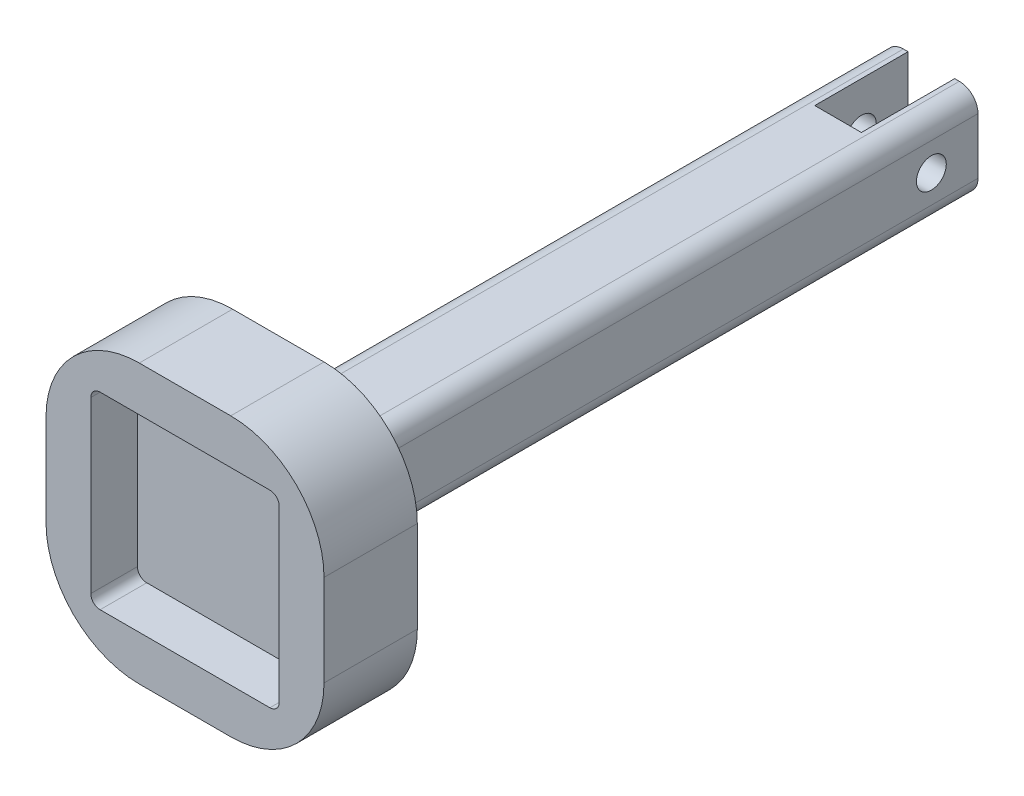
ISO-10303-21;
HEADER;
FILE_DESCRIPTION(('STEP AP214'),'2;1');
FILE_NAME('part.step','',(''),(''),'','','');
FILE_SCHEMA(('AUTOMOTIVE_DESIGN { 1 0 10303 214 1 1 1 1 }'));
ENDSEC;
DATA;
#1=APPLICATION_CONTEXT('core data for automotive mechanical design processes');
#2=APPLICATION_PROTOCOL_DEFINITION('international standard','automotive_design',2000,#1);
#3=PRODUCT_CONTEXT('',#1,'mechanical');
#4=PRODUCT('Part','Part','',(#3));
#5=PRODUCT_RELATED_PRODUCT_CATEGORY('part','',(#4));
#6=PRODUCT_DEFINITION_FORMATION('','',#4);
#7=PRODUCT_DEFINITION_CONTEXT('part definition',#1,'design');
#8=PRODUCT_DEFINITION('design','',#6,#7);
#9=PRODUCT_DEFINITION_SHAPE('','',#8);
#10=(LENGTH_UNIT() NAMED_UNIT(*) SI_UNIT(.MILLI.,.METRE.));
#11=(NAMED_UNIT(*) PLANE_ANGLE_UNIT() SI_UNIT($,.RADIAN.));
#12=(NAMED_UNIT(*) SI_UNIT($,.STERADIAN.) SOLID_ANGLE_UNIT());
#13=UNCERTAINTY_MEASURE_WITH_UNIT(LENGTH_MEASURE(1.E-05),#10,'distance_accuracy_value','');
#14=(GEOMETRIC_REPRESENTATION_CONTEXT(3) GLOBAL_UNCERTAINTY_ASSIGNED_CONTEXT((#13)) GLOBAL_UNIT_ASSIGNED_CONTEXT((#10,
#11,#12)) REPRESENTATION_CONTEXT('',''));
#15=CARTESIAN_POINT('',(0.,0.,0.));
#16=DIRECTION('',(0.,0.,1.));
#17=DIRECTION('',(1.,0.,0.));
#18=AXIS2_PLACEMENT_3D('',#15,#16,#17);
#19=CARTESIAN_POINT('',(0.,0.,-70.));
#20=DIRECTION('',(0.,0.,1.));
#21=DIRECTION('',(1.,0.,0.));
#22=AXIS2_PLACEMENT_3D('',#19,#20,#21);
#23=PLANE('',#22);
#24=DIRECTION('',(0.,-1.,0.));
#25=VECTOR('',#24,1.);
#26=CARTESIAN_POINT('',(5.,-5.,-70.));
#27=LINE('',#26,#25);
#28=CARTESIAN_POINT('',(5.,3.,-70.));
#29=VERTEX_POINT('',#28);
#30=CARTESIAN_POINT('',(5.,-3.,-70.));
#31=VERTEX_POINT('',#30);
#32=EDGE_CURVE('E327',#29,#31,#27,.T.);
#33=ORIENTED_EDGE('',*,*,#32,.T.);
#34=CARTESIAN_POINT('',(3.,-3.,-70.));
#35=DIRECTION('',(0.,0.,1.));
#36=DIRECTION('',(1.,0.,0.));
#37=AXIS2_PLACEMENT_3D('',#34,#35,#36);
#38=CIRCLE('',#37,2.);
#39=CARTESIAN_POINT('',(3.,-5.,-70.));
#40=VERTEX_POINT('',#39);
#41=EDGE_CURVE('E434',#31,#40,#38,.F.);
#42=ORIENTED_EDGE('',*,*,#41,.T.);
#43=DIRECTION('',(-1.,0.,0.));
#44=VECTOR('',#43,1.);
#45=CARTESIAN_POINT('',(5.,-5.,-70.));
#46=LINE('',#45,#44);
#47=CARTESIAN_POINT('',(2.49999999999999,-5.,-70.));
#48=VERTEX_POINT('',#47);
#49=EDGE_CURVE('E331',#40,#48,#46,.T.);
#50=ORIENTED_EDGE('',*,*,#49,.T.);
#51=DIRECTION('',(0.,1.,0.));
#52=VECTOR('',#51,1.);
#53=CARTESIAN_POINT('',(2.49999999999999,0.,-70.));
#54=LINE('',#53,#52);
#55=CARTESIAN_POINT('',(2.49999999999999,5.,-70.));
#56=VERTEX_POINT('',#55);
#57=EDGE_CURVE('E405',#48,#56,#54,.T.);
#58=ORIENTED_EDGE('',*,*,#57,.T.);
#59=DIRECTION('',(1.,0.,0.));
#60=VECTOR('',#59,1.);
#61=CARTESIAN_POINT('',(5.,5.,-70.));
#62=LINE('',#61,#60);
#63=CARTESIAN_POINT('',(3.,5.,-70.));
#64=VERTEX_POINT('',#63);
#65=EDGE_CURVE('E323',#56,#64,#62,.T.);
#66=ORIENTED_EDGE('',*,*,#65,.T.);
#67=CARTESIAN_POINT('',(3.,3.,-70.));
#68=DIRECTION('',(0.,0.,1.));
#69=DIRECTION('',(1.,0.,0.));
#70=AXIS2_PLACEMENT_3D('',#67,#68,#69);
#71=CIRCLE('',#70,2.);
#72=EDGE_CURVE('E432',#64,#29,#71,.F.);
#73=ORIENTED_EDGE('',*,*,#72,.T.);
#74=EDGE_LOOP('',(#33,#42,#50,#58,#66,#73));
#75=FACE_BOUND('',#74,.T.);
#76=ADVANCED_FACE('F33',(#75),#23,.F.);
#77=CARTESIAN_POINT('',(-14.9,-14.9,10.));
#78=DIRECTION('',(-1.,0.,0.));
#79=DIRECTION('',(0.,0.,1.));
#80=AXIS2_PLACEMENT_3D('',#77,#78,#79);
#81=PLANE('',#80);
#82=DIRECTION('',(0.,1.,0.));
#83=VECTOR('',#82,1.);
#84=CARTESIAN_POINT('',(-14.9,-14.9,0.));
#85=LINE('',#84,#83);
#86=CARTESIAN_POINT('',(-14.9,-4.9,0.));
#87=VERTEX_POINT('',#86);
#88=CARTESIAN_POINT('',(-14.9,4.9,0.));
#89=VERTEX_POINT('',#88);
#90=EDGE_CURVE('E333',#87,#89,#85,.T.);
#91=ORIENTED_EDGE('',*,*,#90,.F.);
#92=DIRECTION('',(0.,0.,-1.));
#93=VECTOR('',#92,1.);
#94=CARTESIAN_POINT('',(-14.9,-4.9,10.));
#95=LINE('',#94,#93);
#96=CARTESIAN_POINT('',(-14.9,-4.9,10.));
#97=VERTEX_POINT('',#96);
#98=EDGE_CURVE('E395',#87,#97,#95,.F.);
#99=ORIENTED_EDGE('',*,*,#98,.T.);
#100=DIRECTION('',(0.,1.,0.));
#101=VECTOR('',#100,1.);
#102=CARTESIAN_POINT('',(-14.9,-14.9,10.));
#103=LINE('',#102,#101);
#104=CARTESIAN_POINT('',(-14.9,4.9,10.));
#105=VERTEX_POINT('',#104);
#106=EDGE_CURVE('E343',#97,#105,#103,.T.);
#107=ORIENTED_EDGE('',*,*,#106,.T.);
#108=DIRECTION('',(0.,0.,-1.));
#109=VECTOR('',#108,1.);
#110=CARTESIAN_POINT('',(-14.9,4.9,10.));
#111=LINE('',#110,#109);
#112=EDGE_CURVE('E392',#105,#89,#111,.T.);
#113=ORIENTED_EDGE('',*,*,#112,.T.);
#114=EDGE_LOOP('',(#91,#99,#107,#113));
#115=FACE_BOUND('',#114,.T.);
#116=ADVANCED_FACE('F500',(#115),#81,.T.);
#117=CARTESIAN_POINT('',(-14.9,-14.9,10.));
#118=DIRECTION('',(0.,1.,0.));
#119=DIRECTION('',(0.,0.,1.));
#120=AXIS2_PLACEMENT_3D('',#117,#118,#119);
#121=PLANE('',#120);
#122=DIRECTION('',(1.,0.,0.));
#123=VECTOR('',#122,1.);
#124=CARTESIAN_POINT('',(-14.9,-14.9,0.));
#125=LINE('',#124,#123);
#126=CARTESIAN_POINT('',(-4.9,-14.9,0.));
#127=VERTEX_POINT('',#126);
#128=CARTESIAN_POINT('',(4.9,-14.9,0.));
#129=VERTEX_POINT('',#128);
#130=EDGE_CURVE('E347',#127,#129,#125,.T.);
#131=ORIENTED_EDGE('',*,*,#130,.T.);
#132=DIRECTION('',(0.,0.,-1.));
#133=VECTOR('',#132,1.);
#134=CARTESIAN_POINT('',(4.9,-14.9,10.));
#135=LINE('',#134,#133);
#136=CARTESIAN_POINT('',(4.9,-14.9,10.));
#137=VERTEX_POINT('',#136);
#138=EDGE_CURVE('E382',#129,#137,#135,.F.);
#139=ORIENTED_EDGE('',*,*,#138,.T.);
#140=DIRECTION('',(1.,0.,0.));
#141=VECTOR('',#140,1.);
#142=CARTESIAN_POINT('',(-14.9,-14.9,10.));
#143=LINE('',#142,#141);
#144=CARTESIAN_POINT('',(-4.9,-14.9,10.));
#145=VERTEX_POINT('',#144);
#146=EDGE_CURVE('E353',#145,#137,#143,.T.);
#147=ORIENTED_EDGE('',*,*,#146,.F.);
#148=DIRECTION('',(0.,0.,-1.));
#149=VECTOR('',#148,1.);
#150=CARTESIAN_POINT('',(-4.9,-14.9,0.));
#151=LINE('',#150,#149);
#152=EDGE_CURVE('E379',#145,#127,#151,.T.);
#153=ORIENTED_EDGE('',*,*,#152,.T.);
#154=EDGE_LOOP('',(#131,#139,#147,#153));
#155=FACE_BOUND('',#154,.T.);
#156=ADVANCED_FACE('F505',(#155),#121,.F.);
#157=CARTESIAN_POINT('',(14.9,-14.9,10.));
#158=DIRECTION('',(-1.,0.,0.));
#159=DIRECTION('',(0.,0.,1.));
#160=AXIS2_PLACEMENT_3D('',#157,#158,#159);
#161=PLANE('',#160);
#162=DIRECTION('',(0.,1.,0.));
#163=VECTOR('',#162,1.);
#164=CARTESIAN_POINT('',(14.9,-14.9,10.));
#165=LINE('',#164,#163);
#166=CARTESIAN_POINT('',(14.9,-4.9,10.));
#167=VERTEX_POINT('',#166);
#168=CARTESIAN_POINT('',(14.9,4.9,10.));
#169=VERTEX_POINT('',#168);
#170=EDGE_CURVE('E350',#167,#169,#165,.T.);
#171=ORIENTED_EDGE('',*,*,#170,.F.);
#172=DIRECTION('',(0.,0.,-1.));
#173=VECTOR('',#172,1.);
#174=CARTESIAN_POINT('',(14.9,-4.9,10.));
#175=LINE('',#174,#173);
#176=CARTESIAN_POINT('',(14.9,-4.9,0.));
#177=VERTEX_POINT('',#176);
#178=EDGE_CURVE('E368',#167,#177,#175,.T.);
#179=ORIENTED_EDGE('',*,*,#178,.T.);
#180=DIRECTION('',(0.,1.,0.));
#181=VECTOR('',#180,1.);
#182=CARTESIAN_POINT('',(14.9,-14.9,0.));
#183=LINE('',#182,#181);
#184=CARTESIAN_POINT('',(14.9,4.9,0.));
#185=VERTEX_POINT('',#184);
#186=EDGE_CURVE('E362',#177,#185,#183,.T.);
#187=ORIENTED_EDGE('',*,*,#186,.T.);
#188=DIRECTION('',(0.,0.,-1.));
#189=VECTOR('',#188,1.);
#190=CARTESIAN_POINT('',(14.9,4.9,10.));
#191=LINE('',#190,#189);
#192=EDGE_CURVE('E356',#185,#169,#191,.F.);
#193=ORIENTED_EDGE('',*,*,#192,.T.);
#194=EDGE_LOOP('',(#171,#179,#187,#193));
#195=FACE_BOUND('',#194,.T.);
#196=ADVANCED_FACE('F538',(#195),#161,.F.);
#197=CARTESIAN_POINT('',(-14.9,14.9,10.));
#198=DIRECTION('',(0.,1.,0.));
#199=DIRECTION('',(0.,0.,1.));
#200=AXIS2_PLACEMENT_3D('',#197,#198,#199);
#201=PLANE('',#200);
#202=DIRECTION('',(1.,0.,0.));
#203=VECTOR('',#202,1.);
#204=CARTESIAN_POINT('',(-14.9,14.9,10.));
#205=LINE('',#204,#203);
#206=CARTESIAN_POINT('',(-4.9,14.9,10.));
#207=VERTEX_POINT('',#206);
#208=CARTESIAN_POINT('',(4.9,14.9,10.));
#209=VERTEX_POINT('',#208);
#210=EDGE_CURVE('E346',#207,#209,#205,.T.);
#211=ORIENTED_EDGE('',*,*,#210,.T.);
#212=DIRECTION('',(0.,0.,-1.));
#213=VECTOR('',#212,1.);
#214=CARTESIAN_POINT('',(4.9,14.9,0.));
#215=LINE('',#214,#213);
#216=CARTESIAN_POINT('',(4.9,14.9,0.));
#217=VERTEX_POINT('',#216);
#218=EDGE_CURVE('E399',#209,#217,#215,.T.);
#219=ORIENTED_EDGE('',*,*,#218,.T.);
#220=DIRECTION('',(1.,0.,0.));
#221=VECTOR('',#220,1.);
#222=CARTESIAN_POINT('',(-14.9,14.9,0.));
#223=LINE('',#222,#221);
#224=CARTESIAN_POINT('',(-4.9,14.9,0.));
#225=VERTEX_POINT('',#224);
#226=EDGE_CURVE('E359',#225,#217,#223,.T.);
#227=ORIENTED_EDGE('',*,*,#226,.F.);
#228=DIRECTION('',(0.,0.,-1.));
#229=VECTOR('',#228,1.);
#230=CARTESIAN_POINT('',(-4.9,14.9,10.));
#231=LINE('',#230,#229);
#232=EDGE_CURVE('E397',#225,#207,#231,.F.);
#233=ORIENTED_EDGE('',*,*,#232,.T.);
#234=EDGE_LOOP('',(#211,#219,#227,#233));
#235=FACE_BOUND('',#234,.T.);
#236=ADVANCED_FACE('F531',(#235),#201,.T.);
#237=CARTESIAN_POINT('',(0.,0.,10.));
#238=DIRECTION('',(0.,0.,-1.));
#239=DIRECTION('',(-1.,0.,0.));
#240=AXIS2_PLACEMENT_3D('',#237,#238,#239);
#241=PLANE('',#240);
#242=DIRECTION('',(1.,0.,0.));
#243=VECTOR('',#242,1.);
#244=CARTESIAN_POINT('',(-9.09999999999999,-10.1,10.));
#245=LINE('',#244,#243);
#246=CARTESIAN_POINT('',(-9.09999999999999,-10.1,10.));
#247=VERTEX_POINT('',#246);
#248=CARTESIAN_POINT('',(9.09999999999999,-10.1,10.));
#249=VERTEX_POINT('',#248);
#250=EDGE_CURVE('E262',#247,#249,#245,.T.);
#251=ORIENTED_EDGE('',*,*,#250,.F.);
#252=CARTESIAN_POINT('',(-9.1,-9.1,10.));
#253=DIRECTION('',(0.,0.,1.));
#254=DIRECTION('',(-1.,0.,0.));
#255=AXIS2_PLACEMENT_3D('',#252,#253,#254);
#256=CIRCLE('',#255,0.999999999999999);
#257=CARTESIAN_POINT('',(-10.1,-9.09999999999999,10.));
#258=VERTEX_POINT('',#257);
#259=EDGE_CURVE('E224',#258,#247,#256,.T.);
#260=ORIENTED_EDGE('',*,*,#259,.F.);
#261=DIRECTION('',(0.,-1.,0.));
#262=VECTOR('',#261,1.);
#263=CARTESIAN_POINT('',(-10.1,-9.09999999999999,10.));
#264=LINE('',#263,#262);
#265=CARTESIAN_POINT('',(-10.1,9.09999999999999,10.));
#266=VERTEX_POINT('',#265);
#267=EDGE_CURVE('E242',#266,#258,#264,.T.);
#268=ORIENTED_EDGE('',*,*,#267,.F.);
#269=CARTESIAN_POINT('',(-9.1,9.1,10.));
#270=DIRECTION('',(0.,0.,1.));
#271=DIRECTION('',(-1.,0.,0.));
#272=AXIS2_PLACEMENT_3D('',#269,#270,#271);
#273=CIRCLE('',#272,0.999999999999999);
#274=CARTESIAN_POINT('',(-9.09999999999999,10.1,10.));
#275=VERTEX_POINT('',#274);
#276=EDGE_CURVE('E245',#275,#266,#273,.T.);
#277=ORIENTED_EDGE('',*,*,#276,.F.);
#278=DIRECTION('',(-1.,0.,0.));
#279=VECTOR('',#278,1.);
#280=CARTESIAN_POINT('',(-9.09999999999999,10.1,10.));
#281=LINE('',#280,#279);
#282=CARTESIAN_POINT('',(9.09999999999999,10.1,10.));
#283=VERTEX_POINT('',#282);
#284=EDGE_CURVE('E273',#283,#275,#281,.T.);
#285=ORIENTED_EDGE('',*,*,#284,.F.);
#286=CARTESIAN_POINT('',(9.1,9.1,10.));
#287=DIRECTION('',(0.,0.,1.));
#288=DIRECTION('',(-1.,0.,0.));
#289=AXIS2_PLACEMENT_3D('',#286,#287,#288);
#290=CIRCLE('',#289,0.999999999999999);
#291=CARTESIAN_POINT('',(10.1,9.09999999999999,10.));
#292=VERTEX_POINT('',#291);
#293=EDGE_CURVE('E270',#292,#283,#290,.T.);
#294=ORIENTED_EDGE('',*,*,#293,.F.);
#295=DIRECTION('',(0.,1.,0.));
#296=VECTOR('',#295,1.);
#297=CARTESIAN_POINT('',(10.1,-9.09999999999999,10.));
#298=LINE('',#297,#296);
#299=CARTESIAN_POINT('',(10.1,-9.1,10.));
#300=VERTEX_POINT('',#299);
#301=EDGE_CURVE('E267',#300,#292,#298,.T.);
#302=ORIENTED_EDGE('',*,*,#301,.F.);
#303=CARTESIAN_POINT('',(9.1,-9.1,10.));
#304=DIRECTION('',(0.,0.,1.));
#305=DIRECTION('',(1.,0.,0.));
#306=AXIS2_PLACEMENT_3D('',#303,#304,#305);
#307=CIRCLE('',#306,0.999999999999999);
#308=EDGE_CURVE('E264',#249,#300,#307,.T.);
#309=ORIENTED_EDGE('',*,*,#308,.F.);
#310=EDGE_LOOP('',(#251,#260,#268,#277,#285,#294,#302,#309));
#311=FACE_BOUND('',#310,.T.);
#312=ORIENTED_EDGE('',*,*,#146,.T.);
#313=CARTESIAN_POINT('',(4.9,-4.9,10.));
#314=DIRECTION('',(0.,0.,-1.));
#315=DIRECTION('',(-1.,0.,0.));
#316=AXIS2_PLACEMENT_3D('',#313,#314,#315);
#317=CIRCLE('',#316,10.);
#318=EDGE_CURVE('E390',#137,#167,#317,.F.);
#319=ORIENTED_EDGE('',*,*,#318,.T.);
#320=ORIENTED_EDGE('',*,*,#170,.T.);
#321=CARTESIAN_POINT('',(4.9,4.9,10.));
#322=DIRECTION('',(0.,0.,-1.));
#323=DIRECTION('',(-1.,0.,0.));
#324=AXIS2_PLACEMENT_3D('',#321,#322,#323);
#325=CIRCLE('',#324,10.);
#326=EDGE_CURVE('E386',#169,#209,#325,.F.);
#327=ORIENTED_EDGE('',*,*,#326,.T.);
#328=ORIENTED_EDGE('',*,*,#210,.F.);
#329=CARTESIAN_POINT('',(-4.9,4.9,10.));
#330=DIRECTION('',(0.,0.,-1.));
#331=DIRECTION('',(-1.,0.,0.));
#332=AXIS2_PLACEMENT_3D('',#329,#330,#331);
#333=CIRCLE('',#332,10.);
#334=EDGE_CURVE('E384',#207,#105,#333,.F.);
#335=ORIENTED_EDGE('',*,*,#334,.T.);
#336=ORIENTED_EDGE('',*,*,#106,.F.);
#337=CARTESIAN_POINT('',(-4.9,-4.9,10.));
#338=DIRECTION('',(0.,0.,-1.));
#339=DIRECTION('',(-1.,0.,0.));
#340=AXIS2_PLACEMENT_3D('',#337,#338,#339);
#341=CIRCLE('',#340,10.);
#342=EDGE_CURVE('E388',#97,#145,#341,.F.);
#343=ORIENTED_EDGE('',*,*,#342,.T.);
#344=EDGE_LOOP('',(#312,#319,#320,#327,#328,#335,#336,#343));
#345=FACE_BOUND('',#344,.T.);
#346=ADVANCED_FACE('F528',(#311,#345),#241,.F.);
#347=CARTESIAN_POINT('',(0.,0.,0.));
#348=DIRECTION('',(0.,0.,-1.));
#349=DIRECTION('',(-1.,0.,0.));
#350=AXIS2_PLACEMENT_3D('',#347,#348,#349);
#351=PLANE('',#350);
#352=DIRECTION('',(0.,1.,0.));
#353=VECTOR('',#352,1.);
#354=CARTESIAN_POINT('',(-5.,-5.,0.));
#355=LINE('',#354,#353);
#356=CARTESIAN_POINT('',(-5.,-3.,0.));
#357=VERTEX_POINT('',#356);
#358=CARTESIAN_POINT('',(-5.,3.,0.));
#359=VERTEX_POINT('',#358);
#360=EDGE_CURVE('E319',#357,#359,#355,.T.);
#361=ORIENTED_EDGE('',*,*,#360,.F.);
#362=CARTESIAN_POINT('',(-3.,-3.,0.));
#363=DIRECTION('',(0.,0.,-1.));
#364=DIRECTION('',(-1.,0.,0.));
#365=AXIS2_PLACEMENT_3D('',#362,#363,#364);
#366=CIRCLE('',#365,2.);
#367=CARTESIAN_POINT('',(-3.,-5.,0.));
#368=VERTEX_POINT('',#367);
#369=EDGE_CURVE('E440',#357,#368,#366,.F.);
#370=ORIENTED_EDGE('',*,*,#369,.T.);
#371=DIRECTION('',(-1.,0.,0.));
#372=VECTOR('',#371,1.);
#373=CARTESIAN_POINT('',(5.,-5.,0.));
#374=LINE('',#373,#372);
#375=CARTESIAN_POINT('',(3.,-5.,0.));
#376=VERTEX_POINT('',#375);
#377=EDGE_CURVE('E324',#376,#368,#374,.T.);
#378=ORIENTED_EDGE('',*,*,#377,.F.);
#379=CARTESIAN_POINT('',(3.,-3.,0.));
#380=DIRECTION('',(0.,0.,-1.));
#381=DIRECTION('',(-1.,0.,0.));
#382=AXIS2_PLACEMENT_3D('',#379,#380,#381);
#383=CIRCLE('',#382,2.);
#384=CARTESIAN_POINT('',(5.,-3.,0.));
#385=VERTEX_POINT('',#384);
#386=EDGE_CURVE('E442',#376,#385,#383,.F.);
#387=ORIENTED_EDGE('',*,*,#386,.T.);
#388=DIRECTION('',(0.,-1.,0.));
#389=VECTOR('',#388,1.);
#390=CARTESIAN_POINT('',(5.,-5.,0.));
#391=LINE('',#390,#389);
#392=CARTESIAN_POINT('',(5.,3.,0.));
#393=VERTEX_POINT('',#392);
#394=EDGE_CURVE('E338',#393,#385,#391,.T.);
#395=ORIENTED_EDGE('',*,*,#394,.F.);
#396=CARTESIAN_POINT('',(3.,3.,0.));
#397=DIRECTION('',(0.,0.,-1.));
#398=DIRECTION('',(-1.,0.,0.));
#399=AXIS2_PLACEMENT_3D('',#396,#397,#398);
#400=CIRCLE('',#399,2.);
#401=CARTESIAN_POINT('',(3.,5.,0.));
#402=VERTEX_POINT('',#401);
#403=EDGE_CURVE('E11',#393,#402,#400,.F.);
#404=ORIENTED_EDGE('',*,*,#403,.T.);
#405=DIRECTION('',(1.,0.,0.));
#406=VECTOR('',#405,1.);
#407=CARTESIAN_POINT('',(5.,5.,0.));
#408=LINE('',#407,#406);
#409=CARTESIAN_POINT('',(-3.,5.,0.));
#410=VERTEX_POINT('',#409);
#411=EDGE_CURVE('E336',#410,#402,#408,.T.);
#412=ORIENTED_EDGE('',*,*,#411,.F.);
#413=CARTESIAN_POINT('',(-3.,3.,0.));
#414=DIRECTION('',(0.,0.,-1.));
#415=DIRECTION('',(-1.,0.,0.));
#416=AXIS2_PLACEMENT_3D('',#413,#414,#415);
#417=CIRCLE('',#416,2.);
#418=EDGE_CURVE('E41',#410,#359,#417,.F.);
#419=ORIENTED_EDGE('',*,*,#418,.T.);
#420=EDGE_LOOP('',(#361,#370,#378,#387,#395,#404,#412,#419));
#421=FACE_BOUND('',#420,.T.);
#422=ORIENTED_EDGE('',*,*,#186,.F.);
#423=CARTESIAN_POINT('',(4.9,-4.9,0.));
#424=DIRECTION('',(0.,0.,-1.));
#425=DIRECTION('',(-1.,0.,0.));
#426=AXIS2_PLACEMENT_3D('',#423,#424,#425);
#427=CIRCLE('',#426,10.);
#428=EDGE_CURVE('E377',#177,#129,#427,.T.);
#429=ORIENTED_EDGE('',*,*,#428,.T.);
#430=ORIENTED_EDGE('',*,*,#130,.F.);
#431=CARTESIAN_POINT('',(-4.9,-4.9,0.));
#432=DIRECTION('',(0.,0.,-1.));
#433=DIRECTION('',(-1.,0.,0.));
#434=AXIS2_PLACEMENT_3D('',#431,#432,#433);
#435=CIRCLE('',#434,10.);
#436=EDGE_CURVE('E375',#127,#87,#435,.T.);
#437=ORIENTED_EDGE('',*,*,#436,.T.);
#438=ORIENTED_EDGE('',*,*,#90,.T.);
#439=CARTESIAN_POINT('',(-4.9,4.9,0.));
#440=DIRECTION('',(0.,0.,-1.));
#441=DIRECTION('',(-1.,0.,0.));
#442=AXIS2_PLACEMENT_3D('',#439,#440,#441);
#443=CIRCLE('',#442,10.);
#444=EDGE_CURVE('E371',#89,#225,#443,.T.);
#445=ORIENTED_EDGE('',*,*,#444,.T.);
#446=ORIENTED_EDGE('',*,*,#226,.T.);
#447=CARTESIAN_POINT('',(4.9,4.9,0.));
#448=DIRECTION('',(0.,0.,-1.));
#449=DIRECTION('',(-1.,0.,0.));
#450=AXIS2_PLACEMENT_3D('',#447,#448,#449);
#451=CIRCLE('',#450,10.);
#452=EDGE_CURVE('E373',#217,#185,#451,.T.);
#453=ORIENTED_EDGE('',*,*,#452,.T.);
#454=EDGE_LOOP('',(#422,#429,#430,#437,#438,#445,#446,#453));
#455=FACE_BOUND('',#454,.T.);
#456=ADVANCED_FACE('F444',(#421,#455),#351,.T.);
#457=CARTESIAN_POINT('',(4.9,-4.9,10.));
#458=DIRECTION('',(0.,0.,-1.));
#459=DIRECTION('',(-1.,0.,0.));
#460=AXIS2_PLACEMENT_3D('',#457,#458,#459);
#461=CYLINDRICAL_SURFACE('',#460,10.);
#462=ORIENTED_EDGE('',*,*,#318,.F.);
#463=ORIENTED_EDGE('',*,*,#138,.F.);
#464=ORIENTED_EDGE('',*,*,#428,.F.);
#465=ORIENTED_EDGE('',*,*,#178,.F.);
#466=EDGE_LOOP('',(#462,#463,#464,#465));
#467=FACE_BOUND('',#466,.T.);
#468=ADVANCED_FACE('F535',(#467),#461,.T.);
#469=CARTESIAN_POINT('',(-4.9,-4.9,10.));
#470=DIRECTION('',(0.,0.,1.));
#471=DIRECTION('',(1.,0.,0.));
#472=AXIS2_PLACEMENT_3D('',#469,#470,#471);
#473=CYLINDRICAL_SURFACE('',#472,10.);
#474=ORIENTED_EDGE('',*,*,#342,.F.);
#475=ORIENTED_EDGE('',*,*,#98,.F.);
#476=ORIENTED_EDGE('',*,*,#436,.F.);
#477=ORIENTED_EDGE('',*,*,#152,.F.);
#478=EDGE_LOOP('',(#474,#475,#476,#477));
#479=FACE_BOUND('',#478,.T.);
#480=ADVANCED_FACE('F548',(#479),#473,.T.);
#481=CARTESIAN_POINT('',(4.9,4.9,10.));
#482=DIRECTION('',(0.,0.,1.));
#483=DIRECTION('',(1.,0.,0.));
#484=AXIS2_PLACEMENT_3D('',#481,#482,#483);
#485=CYLINDRICAL_SURFACE('',#484,10.);
#486=ORIENTED_EDGE('',*,*,#326,.F.);
#487=ORIENTED_EDGE('',*,*,#192,.F.);
#488=ORIENTED_EDGE('',*,*,#452,.F.);
#489=ORIENTED_EDGE('',*,*,#218,.F.);
#490=EDGE_LOOP('',(#486,#487,#488,#489));
#491=FACE_BOUND('',#490,.T.);
#492=ADVANCED_FACE('F552',(#491),#485,.T.);
#493=CARTESIAN_POINT('',(-4.9,4.9,10.));
#494=DIRECTION('',(0.,0.,-1.));
#495=DIRECTION('',(-1.,0.,0.));
#496=AXIS2_PLACEMENT_3D('',#493,#494,#495);
#497=CYLINDRICAL_SURFACE('',#496,10.);
#498=ORIENTED_EDGE('',*,*,#334,.F.);
#499=ORIENTED_EDGE('',*,*,#232,.F.);
#500=ORIENTED_EDGE('',*,*,#444,.F.);
#501=ORIENTED_EDGE('',*,*,#112,.F.);
#502=EDGE_LOOP('',(#498,#499,#500,#501));
#503=FACE_BOUND('',#502,.T.);
#504=ADVANCED_FACE('F526',(#503),#497,.T.);
#505=CARTESIAN_POINT('',(-5.,-5.,-70.));
#506=DIRECTION('',(1.,0.,0.));
#507=DIRECTION('',(0.,0.,-1.));
#508=AXIS2_PLACEMENT_3D('',#505,#506,#507);
#509=PLANE('',#508);
#510=CARTESIAN_POINT('',(-5.,0.,-65.));
#511=DIRECTION('',(1.,0.,0.));
#512=DIRECTION('',(0.,0.,-1.));
#513=AXIS2_PLACEMENT_3D('',#510,#511,#512);
#514=CIRCLE('',#513,1.60000000000001);
#515=CARTESIAN_POINT('',(-5.,0.,-66.6));
#516=VERTEX_POINT('',#515);
#517=EDGE_CURVE('E298',#516,#516,#514,.T.);
#518=ORIENTED_EDGE('',*,*,#517,.T.);
#519=EDGE_LOOP('',(#518));
#520=FACE_BOUND('',#519,.T.);
#521=DIRECTION('',(0.,1.,0.));
#522=VECTOR('',#521,1.);
#523=CARTESIAN_POINT('',(-5.,-5.,-70.));
#524=LINE('',#523,#522);
#525=CARTESIAN_POINT('',(-5.,-3.,-70.));
#526=VERTEX_POINT('',#525);
#527=CARTESIAN_POINT('',(-5.,3.,-70.));
#528=VERTEX_POINT('',#527);
#529=EDGE_CURVE('E320',#526,#528,#524,.T.);
#530=ORIENTED_EDGE('',*,*,#529,.F.);
#531=DIRECTION('',(0.,0.,1.));
#532=VECTOR('',#531,1.);
#533=CARTESIAN_POINT('',(-5.,-3.,-70.));
#534=LINE('',#533,#532);
#535=EDGE_CURVE('E415',#526,#357,#534,.T.);
#536=ORIENTED_EDGE('',*,*,#535,.T.);
#537=ORIENTED_EDGE('',*,*,#360,.T.);
#538=DIRECTION('',(0.,0.,1.));
#539=VECTOR('',#538,1.);
#540=CARTESIAN_POINT('',(-5.,3.,-70.));
#541=LINE('',#540,#539);
#542=EDGE_CURVE('E411',#359,#528,#541,.F.);
#543=ORIENTED_EDGE('',*,*,#542,.T.);
#544=EDGE_LOOP('',(#530,#536,#537,#543));
#545=FACE_BOUND('',#544,.T.);
#546=ADVANCED_FACE('F448',(#520,#545),#509,.F.);
#547=CARTESIAN_POINT('',(5.,5.,-70.));
#548=DIRECTION('',(0.,-1.,0.));
#549=DIRECTION('',(0.,0.,-1.));
#550=AXIS2_PLACEMENT_3D('',#547,#548,#549);
#551=PLANE('',#550);
#552=CARTESIAN_POINT('',(-3.,5.,-70.));
#553=VERTEX_POINT('',#552);
#554=CARTESIAN_POINT('',(-2.50000000000001,5.,-70.));
#555=VERTEX_POINT('',#554);
#556=EDGE_CURVE('E325',#553,#555,#62,.T.);
#557=ORIENTED_EDGE('',*,*,#556,.F.);
#558=DIRECTION('',(0.,0.,1.));
#559=VECTOR('',#558,1.);
#560=CARTESIAN_POINT('',(-3.,5.,-70.));
#561=LINE('',#560,#559);
#562=EDGE_CURVE('E438',#553,#410,#561,.T.);
#563=ORIENTED_EDGE('',*,*,#562,.T.);
#564=ORIENTED_EDGE('',*,*,#411,.T.);
#565=DIRECTION('',(0.,0.,1.));
#566=VECTOR('',#565,1.);
#567=CARTESIAN_POINT('',(3.,5.,-70.));
#568=LINE('',#567,#566);
#569=EDGE_CURVE('E436',#402,#64,#568,.F.);
#570=ORIENTED_EDGE('',*,*,#569,.T.);
#571=ORIENTED_EDGE('',*,*,#65,.F.);
#572=DIRECTION('',(0.,0.,-1.));
#573=VECTOR('',#572,1.);
#574=CARTESIAN_POINT('',(2.49999999999999,5.,-70.));
#575=LINE('',#574,#573);
#576=CARTESIAN_POINT('',(2.5,5.,-60.));
#577=VERTEX_POINT('',#576);
#578=EDGE_CURVE('E301',#577,#56,#575,.T.);
#579=ORIENTED_EDGE('',*,*,#578,.F.);
#580=DIRECTION('',(1.,0.,0.));
#581=VECTOR('',#580,1.);
#582=CARTESIAN_POINT('',(2.5,5.,-60.));
#583=LINE('',#582,#581);
#584=CARTESIAN_POINT('',(-2.50000000000001,5.,-60.));
#585=VERTEX_POINT('',#584);
#586=EDGE_CURVE('E306',#585,#577,#583,.T.);
#587=ORIENTED_EDGE('',*,*,#586,.F.);
#588=DIRECTION('',(0.,0.,1.));
#589=VECTOR('',#588,1.);
#590=CARTESIAN_POINT('',(-2.50000000000001,5.,-70.));
#591=LINE('',#590,#589);
#592=EDGE_CURVE('E303',#555,#585,#591,.T.);
#593=ORIENTED_EDGE('',*,*,#592,.F.);
#594=EDGE_LOOP('',(#557,#563,#564,#570,#571,#579,#587,#593));
#595=FACE_BOUND('',#594,.T.);
#596=ADVANCED_FACE('F459',(#595),#551,.F.);
#597=CARTESIAN_POINT('',(5.,-5.,-70.));
#598=DIRECTION('',(-1.,0.,0.));
#599=DIRECTION('',(0.,0.,1.));
#600=AXIS2_PLACEMENT_3D('',#597,#598,#599);
#601=PLANE('',#600);
#602=CARTESIAN_POINT('',(5.,0.,-65.));
#603=DIRECTION('',(1.,0.,0.));
#604=DIRECTION('',(0.,0.,-1.));
#605=AXIS2_PLACEMENT_3D('',#602,#603,#604);
#606=CIRCLE('',#605,1.60000000000001);
#607=CARTESIAN_POINT('',(5.,0.,-66.6));
#608=VERTEX_POINT('',#607);
#609=EDGE_CURVE('E280',#608,#608,#606,.T.);
#610=ORIENTED_EDGE('',*,*,#609,.F.);
#611=EDGE_LOOP('',(#610));
#612=FACE_BOUND('',#611,.T.);
#613=ORIENTED_EDGE('',*,*,#394,.T.);
#614=DIRECTION('',(0.,0.,1.));
#615=VECTOR('',#614,1.);
#616=CARTESIAN_POINT('',(5.,-3.,-70.));
#617=LINE('',#616,#615);
#618=EDGE_CURVE('E430',#385,#31,#617,.F.);
#619=ORIENTED_EDGE('',*,*,#618,.T.);
#620=ORIENTED_EDGE('',*,*,#32,.F.);
#621=DIRECTION('',(0.,0.,1.));
#622=VECTOR('',#621,1.);
#623=CARTESIAN_POINT('',(5.,3.,-70.));
#624=LINE('',#623,#622);
#625=EDGE_CURVE('E427',#29,#393,#624,.T.);
#626=ORIENTED_EDGE('',*,*,#625,.T.);
#627=EDGE_LOOP('',(#613,#619,#620,#626));
#628=FACE_BOUND('',#627,.T.);
#629=ADVANCED_FACE('F477',(#612,#628),#601,.F.);
#630=CARTESIAN_POINT('',(5.,-5.,-70.));
#631=DIRECTION('',(0.,1.,0.));
#632=DIRECTION('',(0.,0.,1.));
#633=AXIS2_PLACEMENT_3D('',#630,#631,#632);
#634=PLANE('',#633);
#635=ORIENTED_EDGE('',*,*,#377,.T.);
#636=DIRECTION('',(0.,0.,1.));
#637=VECTOR('',#636,1.);
#638=CARTESIAN_POINT('',(-3.,-5.,-70.));
#639=LINE('',#638,#637);
#640=CARTESIAN_POINT('',(-3.,-5.,-70.));
#641=VERTEX_POINT('',#640);
#642=EDGE_CURVE('E421',#368,#641,#639,.F.);
#643=ORIENTED_EDGE('',*,*,#642,.T.);
#644=CARTESIAN_POINT('',(-2.50000000000001,-5.,-70.));
#645=VERTEX_POINT('',#644);
#646=EDGE_CURVE('E330',#645,#641,#46,.T.);
#647=ORIENTED_EDGE('',*,*,#646,.F.);
#648=DIRECTION('',(0.,0.,1.));
#649=VECTOR('',#648,1.);
#650=CARTESIAN_POINT('',(-2.50000000000001,-5.,-70.));
#651=LINE('',#650,#649);
#652=CARTESIAN_POINT('',(-2.50000000000001,-5.,-60.));
#653=VERTEX_POINT('',#652);
#654=EDGE_CURVE('E312',#645,#653,#651,.T.);
#655=ORIENTED_EDGE('',*,*,#654,.T.);
#656=DIRECTION('',(1.,0.,0.));
#657=VECTOR('',#656,1.);
#658=CARTESIAN_POINT('',(5.,-5.,-60.));
#659=LINE('',#658,#657);
#660=CARTESIAN_POINT('',(2.5,-5.,-60.));
#661=VERTEX_POINT('',#660);
#662=EDGE_CURVE('E408',#653,#661,#659,.T.);
#663=ORIENTED_EDGE('',*,*,#662,.T.);
#664=DIRECTION('',(0.,0.,-1.));
#665=VECTOR('',#664,1.);
#666=CARTESIAN_POINT('',(2.49999999999999,-5.,-70.));
#667=LINE('',#666,#665);
#668=EDGE_CURVE('E316',#661,#48,#667,.T.);
#669=ORIENTED_EDGE('',*,*,#668,.T.);
#670=ORIENTED_EDGE('',*,*,#49,.F.);
#671=DIRECTION('',(0.,0.,1.));
#672=VECTOR('',#671,1.);
#673=CARTESIAN_POINT('',(3.,-5.,-70.));
#674=LINE('',#673,#672);
#675=EDGE_CURVE('E418',#40,#376,#674,.T.);
#676=ORIENTED_EDGE('',*,*,#675,.T.);
#677=EDGE_LOOP('',(#635,#643,#647,#655,#663,#669,#670,#676));
#678=FACE_BOUND('',#677,.T.);
#679=ADVANCED_FACE('F468',(#678),#634,.F.);
#680=ORIENTED_EDGE('',*,*,#646,.T.);
#681=CARTESIAN_POINT('',(-3.,-3.,-70.));
#682=DIRECTION('',(0.,0.,1.));
#683=DIRECTION('',(1.,0.,0.));
#684=AXIS2_PLACEMENT_3D('',#681,#682,#683);
#685=CIRCLE('',#684,2.);
#686=EDGE_CURVE('E425',#641,#526,#685,.F.);
#687=ORIENTED_EDGE('',*,*,#686,.T.);
#688=ORIENTED_EDGE('',*,*,#529,.T.);
#689=CARTESIAN_POINT('',(-3.,3.,-70.));
#690=DIRECTION('',(0.,0.,1.));
#691=DIRECTION('',(1.,0.,0.));
#692=AXIS2_PLACEMENT_3D('',#689,#690,#691);
#693=CIRCLE('',#692,2.);
#694=EDGE_CURVE('E423',#528,#553,#693,.F.);
#695=ORIENTED_EDGE('',*,*,#694,.T.);
#696=ORIENTED_EDGE('',*,*,#556,.T.);
#697=DIRECTION('',(0.,-1.,0.));
#698=VECTOR('',#697,1.);
#699=CARTESIAN_POINT('',(-2.50000000000001,0.,-70.));
#700=LINE('',#699,#698);
#701=EDGE_CURVE('E402',#555,#645,#700,.T.);
#702=ORIENTED_EDGE('',*,*,#701,.T.);
#703=EDGE_LOOP('',(#680,#687,#688,#695,#696,#702));
#704=FACE_BOUND('',#703,.T.);
#705=ADVANCED_FACE('F455',(#704),#23,.F.);
#706=CARTESIAN_POINT('',(2.5,-14.9,-60.));
#707=DIRECTION('',(0.,0.,1.));
#708=DIRECTION('',(1.,0.,0.));
#709=AXIS2_PLACEMENT_3D('',#706,#707,#708);
#710=PLANE('',#709);
#711=DIRECTION('',(0.,1.,0.));
#712=VECTOR('',#711,1.);
#713=CARTESIAN_POINT('',(-2.50000000000001,-14.9,-60.));
#714=LINE('',#713,#712);
#715=EDGE_CURVE('E309',#653,#585,#714,.T.);
#716=ORIENTED_EDGE('',*,*,#715,.T.);
#717=ORIENTED_EDGE('',*,*,#586,.T.);
#718=DIRECTION('',(0.,1.,0.));
#719=VECTOR('',#718,1.);
#720=CARTESIAN_POINT('',(2.5,-14.9,-60.));
#721=LINE('',#720,#719);
#722=EDGE_CURVE('E310',#661,#577,#721,.T.);
#723=ORIENTED_EDGE('',*,*,#722,.F.);
#724=ORIENTED_EDGE('',*,*,#662,.F.);
#725=EDGE_LOOP('',(#716,#717,#723,#724));
#726=FACE_BOUND('',#725,.T.);
#727=ADVANCED_FACE('F489',(#726),#710,.F.);
#728=CARTESIAN_POINT('',(2.49999999999999,-14.9,-70.));
#729=DIRECTION('',(1.,0.,0.));
#730=DIRECTION('',(0.,0.,-1.));
#731=AXIS2_PLACEMENT_3D('',#728,#729,#730);
#732=PLANE('',#731);
#733=CARTESIAN_POINT('',(2.5,0.,-65.));
#734=DIRECTION('',(1.,0.,0.));
#735=DIRECTION('',(0.,0.,-1.));
#736=AXIS2_PLACEMENT_3D('',#733,#734,#735);
#737=CIRCLE('',#736,1.60000000000001);
#738=CARTESIAN_POINT('',(2.5,0.,-66.6));
#739=VERTEX_POINT('',#738);
#740=EDGE_CURVE('E295',#739,#739,#737,.T.);
#741=ORIENTED_EDGE('',*,*,#740,.T.);
#742=EDGE_LOOP('',(#741));
#743=FACE_BOUND('',#742,.T.);
#744=ORIENTED_EDGE('',*,*,#722,.T.);
#745=ORIENTED_EDGE('',*,*,#578,.T.);
#746=ORIENTED_EDGE('',*,*,#57,.F.);
#747=ORIENTED_EDGE('',*,*,#668,.F.);
#748=EDGE_LOOP('',(#744,#745,#746,#747));
#749=FACE_BOUND('',#748,.T.);
#750=ADVANCED_FACE('F487',(#743,#749),#732,.F.);
#751=CARTESIAN_POINT('',(-2.50000000000001,-14.9,-70.));
#752=DIRECTION('',(-1.,0.,0.));
#753=DIRECTION('',(0.,0.,1.));
#754=AXIS2_PLACEMENT_3D('',#751,#752,#753);
#755=PLANE('',#754);
#756=CARTESIAN_POINT('',(-2.50000000000001,0.,-65.));
#757=DIRECTION('',(-1.,0.,0.));
#758=DIRECTION('',(0.,0.,1.));
#759=AXIS2_PLACEMENT_3D('',#756,#757,#758);
#760=CIRCLE('',#759,1.60000000000001);
#761=CARTESIAN_POINT('',(-2.50000000000001,0.,-63.4));
#762=VERTEX_POINT('',#761);
#763=EDGE_CURVE('E294',#762,#762,#760,.T.);
#764=ORIENTED_EDGE('',*,*,#763,.T.);
#765=EDGE_LOOP('',(#764));
#766=FACE_BOUND('',#765,.T.);
#767=ORIENTED_EDGE('',*,*,#701,.F.);
#768=ORIENTED_EDGE('',*,*,#592,.T.);
#769=ORIENTED_EDGE('',*,*,#715,.F.);
#770=ORIENTED_EDGE('',*,*,#654,.F.);
#771=EDGE_LOOP('',(#767,#768,#769,#770));
#772=FACE_BOUND('',#771,.T.);
#773=ADVANCED_FACE('F464',(#766,#772),#755,.F.);
#774=CARTESIAN_POINT('',(-14.9,0.,-65.));
#775=DIRECTION('',(1.,0.,0.));
#776=DIRECTION('',(0.,0.,-1.));
#777=AXIS2_PLACEMENT_3D('',#774,#775,#776);
#778=CYLINDRICAL_SURFACE('',#777,1.60000000000001);
#779=ORIENTED_EDGE('',*,*,#763,.F.);
#780=EDGE_LOOP('',(#779));
#781=FACE_BOUND('',#780,.T.);
#782=ORIENTED_EDGE('',*,*,#517,.F.);
#783=EDGE_LOOP('',(#782));
#784=FACE_BOUND('',#783,.T.);
#785=ADVANCED_FACE('F668',(#781,#784),#778,.F.);
#786=ORIENTED_EDGE('',*,*,#609,.T.);
#787=EDGE_LOOP('',(#786));
#788=FACE_BOUND('',#787,.T.);
#789=ORIENTED_EDGE('',*,*,#740,.F.);
#790=EDGE_LOOP('',(#789));
#791=FACE_BOUND('',#790,.T.);
#792=ADVANCED_FACE('F659',(#788,#791),#778,.F.);
#793=CARTESIAN_POINT('',(-9.1,-9.1,5.));
#794=DIRECTION('',(0.,0.,1.));
#795=DIRECTION('',(1.,0.,0.));
#796=AXIS2_PLACEMENT_3D('',#793,#794,#795);
#797=CYLINDRICAL_SURFACE('',#796,0.999999999999999);
#798=ORIENTED_EDGE('',*,*,#259,.T.);
#799=DIRECTION('',(0.,0.,1.));
#800=VECTOR('',#799,1.);
#801=CARTESIAN_POINT('',(-9.09999999999999,-10.1,5.));
#802=LINE('',#801,#800);
#803=CARTESIAN_POINT('',(-9.09999999999999,-10.1,5.));
#804=VERTEX_POINT('',#803);
#805=EDGE_CURVE('E217',#804,#247,#802,.T.);
#806=ORIENTED_EDGE('',*,*,#805,.F.);
#807=CARTESIAN_POINT('',(-9.1,-9.1,5.));
#808=DIRECTION('',(0.,0.,1.));
#809=DIRECTION('',(-1.,0.,0.));
#810=AXIS2_PLACEMENT_3D('',#807,#808,#809);
#811=CIRCLE('',#810,0.999999999999999);
#812=CARTESIAN_POINT('',(-10.1,-9.09999999999999,5.));
#813=VERTEX_POINT('',#812);
#814=EDGE_CURVE('E221',#813,#804,#811,.T.);
#815=ORIENTED_EDGE('',*,*,#814,.F.);
#816=DIRECTION('',(0.,0.,1.));
#817=VECTOR('',#816,1.);
#818=CARTESIAN_POINT('',(-10.1,-9.09999999999999,5.));
#819=LINE('',#818,#817);
#820=EDGE_CURVE('E278',#813,#258,#819,.T.);
#821=ORIENTED_EDGE('',*,*,#820,.T.);
#822=EDGE_LOOP('',(#798,#806,#815,#821));
#823=FACE_BOUND('',#822,.T.);
#824=ADVANCED_FACE('F219',(#823),#797,.F.);
#825=CARTESIAN_POINT('',(-10.1,-9.09999999999999,5.));
#826=DIRECTION('',(-1.,0.,0.));
#827=DIRECTION('',(0.,0.,1.));
#828=AXIS2_PLACEMENT_3D('',#825,#826,#827);
#829=PLANE('',#828);
#830=ORIENTED_EDGE('',*,*,#267,.T.);
#831=ORIENTED_EDGE('',*,*,#820,.F.);
#832=DIRECTION('',(0.,-1.,0.));
#833=VECTOR('',#832,1.);
#834=CARTESIAN_POINT('',(-10.1,-9.09999999999999,5.));
#835=LINE('',#834,#833);
#836=CARTESIAN_POINT('',(-10.1,9.09999999999999,5.));
#837=VERTEX_POINT('',#836);
#838=EDGE_CURVE('E229',#837,#813,#835,.T.);
#839=ORIENTED_EDGE('',*,*,#838,.F.);
#840=DIRECTION('',(0.,0.,1.));
#841=VECTOR('',#840,1.);
#842=CARTESIAN_POINT('',(-10.1,9.09999999999999,5.));
#843=LINE('',#842,#841);
#844=EDGE_CURVE('E281',#837,#266,#843,.T.);
#845=ORIENTED_EDGE('',*,*,#844,.T.);
#846=EDGE_LOOP('',(#830,#831,#839,#845));
#847=FACE_BOUND('',#846,.T.);
#848=ADVANCED_FACE('F642',(#847),#829,.F.);
#849=CARTESIAN_POINT('',(-9.1,9.1,5.));
#850=DIRECTION('',(0.,0.,1.));
#851=DIRECTION('',(1.,0.,0.));
#852=AXIS2_PLACEMENT_3D('',#849,#850,#851);
#853=CYLINDRICAL_SURFACE('',#852,0.999999999999999);
#854=ORIENTED_EDGE('',*,*,#276,.T.);
#855=ORIENTED_EDGE('',*,*,#844,.F.);
#856=CARTESIAN_POINT('',(-9.1,9.1,5.));
#857=DIRECTION('',(0.,0.,1.));
#858=DIRECTION('',(-1.,0.,0.));
#859=AXIS2_PLACEMENT_3D('',#856,#857,#858);
#860=CIRCLE('',#859,0.999999999999999);
#861=CARTESIAN_POINT('',(-9.09999999999999,10.1,5.));
#862=VERTEX_POINT('',#861);
#863=EDGE_CURVE('E258',#862,#837,#860,.T.);
#864=ORIENTED_EDGE('',*,*,#863,.F.);
#865=DIRECTION('',(0.,0.,1.));
#866=VECTOR('',#865,1.);
#867=CARTESIAN_POINT('',(-9.09999999999999,10.1,5.));
#868=LINE('',#867,#866);
#869=EDGE_CURVE('E283',#862,#275,#868,.T.);
#870=ORIENTED_EDGE('',*,*,#869,.T.);
#871=EDGE_LOOP('',(#854,#855,#864,#870));
#872=FACE_BOUND('',#871,.T.);
#873=ADVANCED_FACE('F633',(#872),#853,.F.);
#874=CARTESIAN_POINT('',(-9.09999999999999,10.1,5.));
#875=DIRECTION('',(0.,1.,0.));
#876=DIRECTION('',(0.,0.,1.));
#877=AXIS2_PLACEMENT_3D('',#874,#875,#876);
#878=PLANE('',#877);
#879=ORIENTED_EDGE('',*,*,#284,.T.);
#880=ORIENTED_EDGE('',*,*,#869,.F.);
#881=DIRECTION('',(-1.,0.,0.));
#882=VECTOR('',#881,1.);
#883=CARTESIAN_POINT('',(-9.09999999999999,10.1,5.));
#884=LINE('',#883,#882);
#885=CARTESIAN_POINT('',(9.09999999999999,10.1,5.));
#886=VERTEX_POINT('',#885);
#887=EDGE_CURVE('E255',#886,#862,#884,.T.);
#888=ORIENTED_EDGE('',*,*,#887,.F.);
#889=DIRECTION('',(0.,0.,1.));
#890=VECTOR('',#889,1.);
#891=CARTESIAN_POINT('',(9.09999999999999,10.1,5.));
#892=LINE('',#891,#890);
#893=EDGE_CURVE('E285',#886,#283,#892,.T.);
#894=ORIENTED_EDGE('',*,*,#893,.T.);
#895=EDGE_LOOP('',(#879,#880,#888,#894));
#896=FACE_BOUND('',#895,.T.);
#897=ADVANCED_FACE('F624',(#896),#878,.F.);
#898=CARTESIAN_POINT('',(9.1,9.1,5.));
#899=DIRECTION('',(0.,0.,1.));
#900=DIRECTION('',(1.,0.,0.));
#901=AXIS2_PLACEMENT_3D('',#898,#899,#900);
#902=CYLINDRICAL_SURFACE('',#901,0.999999999999999);
#903=ORIENTED_EDGE('',*,*,#293,.T.);
#904=ORIENTED_EDGE('',*,*,#893,.F.);
#905=CARTESIAN_POINT('',(9.1,9.1,5.));
#906=DIRECTION('',(0.,0.,1.));
#907=DIRECTION('',(-1.,0.,0.));
#908=AXIS2_PLACEMENT_3D('',#905,#906,#907);
#909=CIRCLE('',#908,0.999999999999999);
#910=CARTESIAN_POINT('',(10.1,9.09999999999999,5.));
#911=VERTEX_POINT('',#910);
#912=EDGE_CURVE('E252',#911,#886,#909,.T.);
#913=ORIENTED_EDGE('',*,*,#912,.F.);
#914=DIRECTION('',(0.,0.,1.));
#915=VECTOR('',#914,1.);
#916=CARTESIAN_POINT('',(10.1,9.09999999999999,5.));
#917=LINE('',#916,#915);
#918=EDGE_CURVE('E287',#911,#292,#917,.T.);
#919=ORIENTED_EDGE('',*,*,#918,.T.);
#920=EDGE_LOOP('',(#903,#904,#913,#919));
#921=FACE_BOUND('',#920,.T.);
#922=ADVANCED_FACE('F615',(#921),#902,.F.);
#923=CARTESIAN_POINT('',(10.1,-9.09999999999999,5.));
#924=DIRECTION('',(1.,0.,0.));
#925=DIRECTION('',(0.,0.,-1.));
#926=AXIS2_PLACEMENT_3D('',#923,#924,#925);
#927=PLANE('',#926);
#928=ORIENTED_EDGE('',*,*,#301,.T.);
#929=ORIENTED_EDGE('',*,*,#918,.F.);
#930=DIRECTION('',(0.,1.,0.));
#931=VECTOR('',#930,1.);
#932=CARTESIAN_POINT('',(10.1,-9.09999999999999,5.));
#933=LINE('',#932,#931);
#934=CARTESIAN_POINT('',(10.1,-9.1,5.));
#935=VERTEX_POINT('',#934);
#936=EDGE_CURVE('E249',#935,#911,#933,.T.);
#937=ORIENTED_EDGE('',*,*,#936,.F.);
#938=DIRECTION('',(0.,0.,1.));
#939=VECTOR('',#938,1.);
#940=CARTESIAN_POINT('',(10.1,-9.1,5.));
#941=LINE('',#940,#939);
#942=EDGE_CURVE('E289',#935,#300,#941,.T.);
#943=ORIENTED_EDGE('',*,*,#942,.T.);
#944=EDGE_LOOP('',(#928,#929,#937,#943));
#945=FACE_BOUND('',#944,.T.);
#946=ADVANCED_FACE('F606',(#945),#927,.F.);
#947=CARTESIAN_POINT('',(9.1,-9.1,5.));
#948=DIRECTION('',(0.,0.,1.));
#949=DIRECTION('',(1.,0.,0.));
#950=AXIS2_PLACEMENT_3D('',#947,#948,#949);
#951=CYLINDRICAL_SURFACE('',#950,0.999999999999999);
#952=ORIENTED_EDGE('',*,*,#308,.T.);
#953=ORIENTED_EDGE('',*,*,#942,.F.);
#954=CARTESIAN_POINT('',(9.1,-9.1,5.));
#955=DIRECTION('',(0.,0.,1.));
#956=DIRECTION('',(1.,0.,0.));
#957=AXIS2_PLACEMENT_3D('',#954,#955,#956);
#958=CIRCLE('',#957,0.999999999999999);
#959=CARTESIAN_POINT('',(9.09999999999999,-10.1,5.));
#960=VERTEX_POINT('',#959);
#961=EDGE_CURVE('E237',#960,#935,#958,.T.);
#962=ORIENTED_EDGE('',*,*,#961,.F.);
#963=DIRECTION('',(0.,0.,1.));
#964=VECTOR('',#963,1.);
#965=CARTESIAN_POINT('',(9.09999999999999,-10.1,5.));
#966=LINE('',#965,#964);
#967=EDGE_CURVE('E228',#960,#249,#966,.T.);
#968=ORIENTED_EDGE('',*,*,#967,.T.);
#969=EDGE_LOOP('',(#952,#953,#962,#968));
#970=FACE_BOUND('',#969,.T.);
#971=ADVANCED_FACE('F598',(#970),#951,.F.);
#972=CARTESIAN_POINT('',(-9.09999999999999,-10.1,5.));
#973=DIRECTION('',(0.,-1.,0.));
#974=DIRECTION('',(0.,0.,-1.));
#975=AXIS2_PLACEMENT_3D('',#972,#973,#974);
#976=PLANE('',#975);
#977=ORIENTED_EDGE('',*,*,#250,.T.);
#978=ORIENTED_EDGE('',*,*,#967,.F.);
#979=DIRECTION('',(1.,0.,0.));
#980=VECTOR('',#979,1.);
#981=CARTESIAN_POINT('',(-9.09999999999999,-10.1,5.));
#982=LINE('',#981,#980);
#983=EDGE_CURVE('E232',#804,#960,#982,.T.);
#984=ORIENTED_EDGE('',*,*,#983,.F.);
#985=ORIENTED_EDGE('',*,*,#805,.T.);
#986=EDGE_LOOP('',(#977,#978,#984,#985));
#987=FACE_BOUND('',#986,.T.);
#988=ADVANCED_FACE('F233',(#987),#976,.F.);
#989=CARTESIAN_POINT('',(-9.1,-9.1,5.));
#990=DIRECTION('',(0.,0.,-1.));
#991=DIRECTION('',(-1.,0.,0.));
#992=AXIS2_PLACEMENT_3D('',#989,#990,#991);
#993=PLANE('',#992);
#994=ORIENTED_EDGE('',*,*,#814,.T.);
#995=ORIENTED_EDGE('',*,*,#983,.T.);
#996=ORIENTED_EDGE('',*,*,#961,.T.);
#997=ORIENTED_EDGE('',*,*,#936,.T.);
#998=ORIENTED_EDGE('',*,*,#912,.T.);
#999=ORIENTED_EDGE('',*,*,#887,.T.);
#1000=ORIENTED_EDGE('',*,*,#863,.T.);
#1001=ORIENTED_EDGE('',*,*,#838,.T.);
#1002=EDGE_LOOP('',(#994,#995,#996,#997,#998,#999,#1000,#1001));
#1003=FACE_BOUND('',#1002,.T.);
#1004=ADVANCED_FACE('F239',(#1003),#993,.F.);
#1005=CARTESIAN_POINT('',(-3.,-3.,-70.));
#1006=DIRECTION('',(0.,0.,1.));
#1007=DIRECTION('',(1.,0.,0.));
#1008=AXIS2_PLACEMENT_3D('',#1005,#1006,#1007);
#1009=CYLINDRICAL_SURFACE('',#1008,2.);
#1010=ORIENTED_EDGE('',*,*,#686,.F.);
#1011=ORIENTED_EDGE('',*,*,#642,.F.);
#1012=ORIENTED_EDGE('',*,*,#369,.F.);
#1013=ORIENTED_EDGE('',*,*,#535,.F.);
#1014=EDGE_LOOP('',(#1010,#1011,#1012,#1013));
#1015=FACE_BOUND('',#1014,.T.);
#1016=ADVANCED_FACE('F472',(#1015),#1009,.T.);
#1017=CARTESIAN_POINT('',(3.,-3.,-70.));
#1018=DIRECTION('',(0.,0.,1.));
#1019=DIRECTION('',(1.,0.,0.));
#1020=AXIS2_PLACEMENT_3D('',#1017,#1018,#1019);
#1021=CYLINDRICAL_SURFACE('',#1020,2.);
#1022=ORIENTED_EDGE('',*,*,#41,.F.);
#1023=ORIENTED_EDGE('',*,*,#618,.F.);
#1024=ORIENTED_EDGE('',*,*,#386,.F.);
#1025=ORIENTED_EDGE('',*,*,#675,.F.);
#1026=EDGE_LOOP('',(#1022,#1023,#1024,#1025));
#1027=FACE_BOUND('',#1026,.T.);
#1028=ADVANCED_FACE('F481',(#1027),#1021,.T.);
#1029=CARTESIAN_POINT('',(-3.,3.,-70.));
#1030=DIRECTION('',(0.,0.,1.));
#1031=DIRECTION('',(1.,0.,0.));
#1032=AXIS2_PLACEMENT_3D('',#1029,#1030,#1031);
#1033=CYLINDRICAL_SURFACE('',#1032,2.);
#1034=ORIENTED_EDGE('',*,*,#694,.F.);
#1035=ORIENTED_EDGE('',*,*,#542,.F.);
#1036=ORIENTED_EDGE('',*,*,#418,.F.);
#1037=ORIENTED_EDGE('',*,*,#562,.F.);
#1038=EDGE_LOOP('',(#1034,#1035,#1036,#1037));
#1039=FACE_BOUND('',#1038,.T.);
#1040=ADVANCED_FACE('F451',(#1039),#1033,.T.);
#1041=CARTESIAN_POINT('',(3.,3.,-70.));
#1042=DIRECTION('',(0.,0.,1.));
#1043=DIRECTION('',(1.,0.,0.));
#1044=AXIS2_PLACEMENT_3D('',#1041,#1042,#1043);
#1045=CYLINDRICAL_SURFACE('',#1044,2.);
#1046=ORIENTED_EDGE('',*,*,#72,.F.);
#1047=ORIENTED_EDGE('',*,*,#569,.F.);
#1048=ORIENTED_EDGE('',*,*,#403,.F.);
#1049=ORIENTED_EDGE('',*,*,#625,.F.);
#1050=EDGE_LOOP('',(#1046,#1047,#1048,#1049));
#1051=FACE_BOUND('',#1050,.T.);
#1052=ADVANCED_FACE('F35',(#1051),#1045,.T.);
#1053=CLOSED_SHELL('',(#76,#116,#156,#196,#236,#346,#456,#468,#480,#492,#504,#546,#596,#629,
#679,#705,#727,#750,#773,#785,#792,#824,#848,#873,#897,#922,#946,#971,#988,#1004,#1016,#1028,
#1040,#1052));
#1054=MANIFOLD_SOLID_BREP('B2',#1053);
#1055=ADVANCED_BREP_SHAPE_REPRESENTATION('',(#18,#1054),#14);
#1056=SHAPE_DEFINITION_REPRESENTATION(#9,#1055);
ENDSEC;
END-ISO-10303-21;
